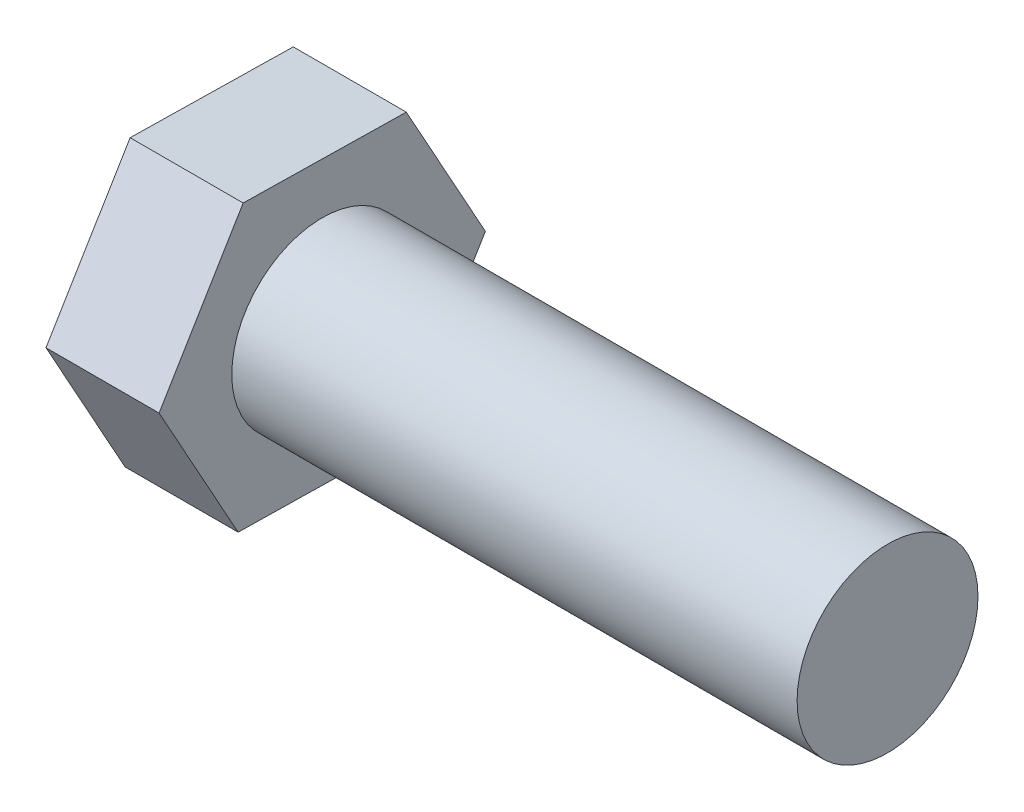
ISO-10303-21;
HEADER;
FILE_DESCRIPTION(('STEP AP214'),'2;1');
FILE_NAME('part.step','',(''),(''),'','','');
FILE_SCHEMA(('AUTOMOTIVE_DESIGN { 1 0 10303 214 1 1 1 1 }'));
ENDSEC;
DATA;
#1=APPLICATION_CONTEXT('core data for automotive mechanical design processes');
#2=APPLICATION_PROTOCOL_DEFINITION('international standard','automotive_design',2000,#1);
#3=PRODUCT_CONTEXT('',#1,'mechanical');
#4=PRODUCT('Part','Part','',(#3));
#5=PRODUCT_RELATED_PRODUCT_CATEGORY('part','',(#4));
#6=PRODUCT_DEFINITION_FORMATION('','',#4);
#7=PRODUCT_DEFINITION_CONTEXT('part definition',#1,'design');
#8=PRODUCT_DEFINITION('design','',#6,#7);
#9=PRODUCT_DEFINITION_SHAPE('','',#8);
#10=(LENGTH_UNIT() NAMED_UNIT(*) SI_UNIT(.MILLI.,.METRE.));
#11=(NAMED_UNIT(*) PLANE_ANGLE_UNIT() SI_UNIT($,.RADIAN.));
#12=(NAMED_UNIT(*) SI_UNIT($,.STERADIAN.) SOLID_ANGLE_UNIT());
#13=UNCERTAINTY_MEASURE_WITH_UNIT(LENGTH_MEASURE(1.E-05),#10,'distance_accuracy_value','');
#14=(GEOMETRIC_REPRESENTATION_CONTEXT(3) GLOBAL_UNCERTAINTY_ASSIGNED_CONTEXT((#13)) GLOBAL_UNIT_ASSIGNED_CONTEXT((#10,
#11,#12)) REPRESENTATION_CONTEXT('',''));
#15=CARTESIAN_POINT('',(0.,0.,0.));
#16=DIRECTION('',(0.,0.,1.));
#17=DIRECTION('',(1.,0.,0.));
#18=AXIS2_PLACEMENT_3D('',#15,#16,#17);
#19=CARTESIAN_POINT('',(-0.6,0.,0.));
#20=DIRECTION('',(-1.,0.,0.));
#21=DIRECTION('',(0.,0.,1.));
#22=AXIS2_PLACEMENT_3D('',#19,#20,#21);
#23=PLANE('',#22);
#24=DIRECTION('',(0.,0.856988725408425,-0.515335157468267));
#25=VECTOR('',#24,1.);
#26=CARTESIAN_POINT('',(-0.6,0.256906077015476,14.4314702161951));
#27=LINE('',#26,#25);
#28=CARTESIAN_POINT('',(-0.6,0.256906077015476,14.4314702161951));
#29=VERTEX_POINT('',#28);
#30=CARTESIAN_POINT('',(-0.6,12.6264728596912,6.99324791901554));
#31=VERTEX_POINT('',#30);
#32=EDGE_CURVE('E126',#29,#31,#27,.T.);
#33=ORIENTED_EDGE('',*,*,#32,.F.);
#34=DIRECTION('',(0.,0.874787700534985,0.484506428226409));
#35=VECTOR('',#34,1.);
#36=CARTESIAN_POINT('',(-0.6,-12.3695667826757,7.43822229717955));
#37=LINE('',#36,#35);
#38=CARTESIAN_POINT('',(-0.6,-12.3695667826757,7.43822229717955));
#39=VERTEX_POINT('',#38);
#40=EDGE_CURVE('E86',#39,#29,#37,.T.);
#41=ORIENTED_EDGE('',*,*,#40,.F.);
#42=DIRECTION('',(0.,0.0177989751265602,0.999841585694676));
#43=VECTOR('',#42,1.);
#44=CARTESIAN_POINT('',(-0.6,-12.6264728596912,-6.99324791901554));
#45=LINE('',#44,#43);
#46=CARTESIAN_POINT('',(-0.6,-12.6264728596912,-6.99324791901554));
#47=VERTEX_POINT('',#46);
#48=EDGE_CURVE('E80',#47,#39,#45,.T.);
#49=ORIENTED_EDGE('',*,*,#48,.F.);
#50=DIRECTION('',(0.,-0.856988725408425,0.515335157468266));
#51=VECTOR('',#50,1.);
#52=CARTESIAN_POINT('',(-0.6,-0.256906077015476,-14.4314702161951));
#53=LINE('',#52,#51);
#54=CARTESIAN_POINT('',(-0.6,-0.256906077015476,-14.4314702161951));
#55=VERTEX_POINT('',#54);
#56=EDGE_CURVE('E116',#55,#47,#53,.T.);
#57=ORIENTED_EDGE('',*,*,#56,.F.);
#58=DIRECTION('',(0.,-0.874787700534985,-0.484506428226409));
#59=VECTOR('',#58,1.);
#60=CARTESIAN_POINT('',(-0.6,12.3695667826757,-7.43822229717955));
#61=LINE('',#60,#59);
#62=CARTESIAN_POINT('',(-0.6,12.3695667826757,-7.43822229717955));
#63=VERTEX_POINT('',#62);
#64=EDGE_CURVE('E131',#63,#55,#61,.T.);
#65=ORIENTED_EDGE('',*,*,#64,.F.);
#66=DIRECTION('',(0.,-0.01779897512656,-0.999841585694676));
#67=VECTOR('',#66,1.);
#68=CARTESIAN_POINT('',(-0.6,12.6264728596912,6.99324791901554));
#69=LINE('',#68,#67);
#70=EDGE_CURVE('E129',#31,#63,#69,.T.);
#71=ORIENTED_EDGE('',*,*,#70,.F.);
#72=EDGE_LOOP('',(#33,#41,#49,#57,#65,#71));
#73=FACE_BOUND('',#72,.T.);
#74=CARTESIAN_POINT('',(-0.600000000000003,0.,0.));
#75=DIRECTION('',(-1.,0.,0.));
#76=DIRECTION('',(0.,0.,1.));
#77=AXIS2_PLACEMENT_3D('',#74,#75,#76);
#78=CIRCLE('',#77,8.);
#79=CARTESIAN_POINT('',(-0.600000000000003,0.,8.));
#80=VERTEX_POINT('',#79);
#81=EDGE_CURVE('E49',#80,#80,#78,.T.);
#82=ORIENTED_EDGE('',*,*,#81,.T.);
#83=EDGE_LOOP('',(#82));
#84=FACE_BOUND('',#83,.T.);
#85=ADVANCED_FACE('F40',(#73,#84),#23,.F.);
#86=CARTESIAN_POINT('',(-10.6,0.256906077015476,14.4314702161951));
#87=DIRECTION('',(0.,-0.515335157468267,-0.856988725408425));
#88=DIRECTION('',(0.,0.856988725408425,-0.515335157468267));
#89=AXIS2_PLACEMENT_3D('',#86,#87,#88);
#90=PLANE('',#89);
#91=ORIENTED_EDGE('',*,*,#32,.T.);
#92=DIRECTION('',(1.,0.,0.));
#93=VECTOR('',#92,1.);
#94=CARTESIAN_POINT('',(-10.6,12.6264728596912,6.99324791901554));
#95=LINE('',#94,#93);
#96=CARTESIAN_POINT('',(-10.6,12.6264728596912,6.99324791901554));
#97=VERTEX_POINT('',#96);
#98=EDGE_CURVE('E143',#97,#31,#95,.T.);
#99=ORIENTED_EDGE('',*,*,#98,.F.);
#100=DIRECTION('',(0.,0.856988725408425,-0.515335157468267));
#101=VECTOR('',#100,1.);
#102=CARTESIAN_POINT('',(-10.6,0.256906077015476,14.4314702161951));
#103=LINE('',#102,#101);
#104=CARTESIAN_POINT('',(-10.6,0.256906077015476,14.4314702161951));
#105=VERTEX_POINT('',#104);
#106=EDGE_CURVE('E136',#105,#97,#103,.T.);
#107=ORIENTED_EDGE('',*,*,#106,.F.);
#108=DIRECTION('',(1.,0.,0.));
#109=VECTOR('',#108,1.);
#110=CARTESIAN_POINT('',(-10.6,0.256906077015476,14.4314702161951));
#111=LINE('',#110,#109);
#112=EDGE_CURVE('E122',#105,#29,#111,.T.);
#113=ORIENTED_EDGE('',*,*,#112,.T.);
#114=EDGE_LOOP('',(#91,#99,#107,#113));
#115=FACE_BOUND('',#114,.T.);
#116=ADVANCED_FACE('F160',(#115),#90,.F.);
#117=CARTESIAN_POINT('',(-10.6,12.6264728596912,6.99324791901554));
#118=DIRECTION('',(0.,-0.999841585694676,0.01779897512656));
#119=DIRECTION('',(0.,-0.01779897512656,-0.999841585694676));
#120=AXIS2_PLACEMENT_3D('',#117,#118,#119);
#121=PLANE('',#120);
#122=ORIENTED_EDGE('',*,*,#70,.T.);
#123=DIRECTION('',(1.,0.,0.));
#124=VECTOR('',#123,1.);
#125=CARTESIAN_POINT('',(-10.6,12.3695667826757,-7.43822229717955));
#126=LINE('',#125,#124);
#127=CARTESIAN_POINT('',(-10.6,12.3695667826757,-7.43822229717955));
#128=VERTEX_POINT('',#127);
#129=EDGE_CURVE('E140',#128,#63,#126,.T.);
#130=ORIENTED_EDGE('',*,*,#129,.F.);
#131=DIRECTION('',(0.,-0.01779897512656,-0.999841585694676));
#132=VECTOR('',#131,1.);
#133=CARTESIAN_POINT('',(-10.6,12.6264728596912,6.99324791901554));
#134=LINE('',#133,#132);
#135=EDGE_CURVE('E95',#97,#128,#134,.T.);
#136=ORIENTED_EDGE('',*,*,#135,.F.);
#137=ORIENTED_EDGE('',*,*,#98,.T.);
#138=EDGE_LOOP('',(#122,#130,#136,#137));
#139=FACE_BOUND('',#138,.T.);
#140=ADVANCED_FACE('F166',(#139),#121,.F.);
#141=CARTESIAN_POINT('',(-10.6,12.3695667826757,-7.43822229717955));
#142=DIRECTION('',(0.,-0.484506428226409,0.874787700534986));
#143=DIRECTION('',(0.,-0.874787700534986,-0.484506428226409));
#144=AXIS2_PLACEMENT_3D('',#141,#142,#143);
#145=PLANE('',#144);
#146=ORIENTED_EDGE('',*,*,#64,.T.);
#147=DIRECTION('',(1.,0.,0.));
#148=VECTOR('',#147,1.);
#149=CARTESIAN_POINT('',(-10.6,-0.256906077015476,-14.4314702161951));
#150=LINE('',#149,#148);
#151=CARTESIAN_POINT('',(-10.6,-0.256906077015476,-14.4314702161951));
#152=VERTEX_POINT('',#151);
#153=EDGE_CURVE('E117',#152,#55,#150,.T.);
#154=ORIENTED_EDGE('',*,*,#153,.F.);
#155=DIRECTION('',(0.,-0.874787700534985,-0.484506428226409));
#156=VECTOR('',#155,1.);
#157=CARTESIAN_POINT('',(-10.6,12.3695667826757,-7.43822229717955));
#158=LINE('',#157,#156);
#159=EDGE_CURVE('E108',#128,#152,#158,.T.);
#160=ORIENTED_EDGE('',*,*,#159,.F.);
#161=ORIENTED_EDGE('',*,*,#129,.T.);
#162=EDGE_LOOP('',(#146,#154,#160,#161));
#163=FACE_BOUND('',#162,.T.);
#164=ADVANCED_FACE('F177',(#163),#145,.F.);
#165=CARTESIAN_POINT('',(-10.6,-0.256906077015476,-14.4314702161951));
#166=DIRECTION('',(0.,0.515335157468266,0.856988725408425));
#167=DIRECTION('',(0.,-0.856988725408425,0.515335157468266));
#168=AXIS2_PLACEMENT_3D('',#165,#166,#167);
#169=PLANE('',#168);
#170=ORIENTED_EDGE('',*,*,#56,.T.);
#171=DIRECTION('',(1.,0.,0.));
#172=VECTOR('',#171,1.);
#173=CARTESIAN_POINT('',(-10.6,-12.6264728596912,-6.99324791901554));
#174=LINE('',#173,#172);
#175=CARTESIAN_POINT('',(-10.6,-12.6264728596912,-6.99324791901554));
#176=VERTEX_POINT('',#175);
#177=EDGE_CURVE('E113',#176,#47,#174,.T.);
#178=ORIENTED_EDGE('',*,*,#177,.F.);
#179=DIRECTION('',(0.,-0.856988725408425,0.515335157468266));
#180=VECTOR('',#179,1.);
#181=CARTESIAN_POINT('',(-10.6,-0.256906077015476,-14.4314702161951));
#182=LINE('',#181,#180);
#183=EDGE_CURVE('E102',#152,#176,#182,.T.);
#184=ORIENTED_EDGE('',*,*,#183,.F.);
#185=ORIENTED_EDGE('',*,*,#153,.T.);
#186=EDGE_LOOP('',(#170,#178,#184,#185));
#187=FACE_BOUND('',#186,.T.);
#188=ADVANCED_FACE('F114',(#187),#169,.F.);
#189=CARTESIAN_POINT('',(-10.6,-12.6264728596912,-6.99324791901554));
#190=DIRECTION('',(0.,0.999841585694676,-0.0177989751265602));
#191=DIRECTION('',(0.,0.0177989751265602,0.999841585694676));
#192=AXIS2_PLACEMENT_3D('',#189,#190,#191);
#193=PLANE('',#192);
#194=ORIENTED_EDGE('',*,*,#48,.T.);
#195=DIRECTION('',(1.,0.,0.));
#196=VECTOR('',#195,1.);
#197=CARTESIAN_POINT('',(-10.6,-12.3695667826757,7.43822229717955));
#198=LINE('',#197,#196);
#199=CARTESIAN_POINT('',(-10.6,-12.3695667826757,7.43822229717955));
#200=VERTEX_POINT('',#199);
#201=EDGE_CURVE('E118',#200,#39,#198,.T.);
#202=ORIENTED_EDGE('',*,*,#201,.F.);
#203=DIRECTION('',(0.,0.0177989751265602,0.999841585694676));
#204=VECTOR('',#203,1.);
#205=CARTESIAN_POINT('',(-10.6,-12.6264728596912,-6.99324791901554));
#206=LINE('',#205,#204);
#207=EDGE_CURVE('E106',#176,#200,#206,.T.);
#208=ORIENTED_EDGE('',*,*,#207,.F.);
#209=ORIENTED_EDGE('',*,*,#177,.T.);
#210=EDGE_LOOP('',(#194,#202,#208,#209));
#211=FACE_BOUND('',#210,.T.);
#212=ADVANCED_FACE('F120',(#211),#193,.F.);
#213=CARTESIAN_POINT('',(-10.6,-12.3695667826757,7.43822229717955));
#214=DIRECTION('',(0.,0.48450642822641,-0.874787700534985));
#215=DIRECTION('',(0.,0.874787700534985,0.48450642822641));
#216=AXIS2_PLACEMENT_3D('',#213,#214,#215);
#217=PLANE('',#216);
#218=ORIENTED_EDGE('',*,*,#40,.T.);
#219=ORIENTED_EDGE('',*,*,#112,.F.);
#220=DIRECTION('',(0.,0.874787700534985,0.484506428226409));
#221=VECTOR('',#220,1.);
#222=CARTESIAN_POINT('',(-10.6,-12.3695667826757,7.43822229717955));
#223=LINE('',#222,#221);
#224=EDGE_CURVE('E57',#200,#105,#223,.T.);
#225=ORIENTED_EDGE('',*,*,#224,.F.);
#226=ORIENTED_EDGE('',*,*,#201,.T.);
#227=EDGE_LOOP('',(#218,#219,#225,#226));
#228=FACE_BOUND('',#227,.T.);
#229=ADVANCED_FACE('F156',(#228),#217,.F.);
#230=CARTESIAN_POINT('',(-10.6,0.,0.));
#231=DIRECTION('',(-1.,0.,0.));
#232=DIRECTION('',(0.,0.,1.));
#233=AXIS2_PLACEMENT_3D('',#230,#231,#232);
#234=PLANE('',#233);
#235=ORIENTED_EDGE('',*,*,#106,.T.);
#236=ORIENTED_EDGE('',*,*,#135,.T.);
#237=ORIENTED_EDGE('',*,*,#159,.T.);
#238=ORIENTED_EDGE('',*,*,#183,.T.);
#239=ORIENTED_EDGE('',*,*,#207,.T.);
#240=ORIENTED_EDGE('',*,*,#224,.T.);
#241=EDGE_LOOP('',(#235,#236,#237,#238,#239,#240));
#242=FACE_BOUND('',#241,.T.);
#243=ADVANCED_FACE('F104',(#242),#234,.T.);
#244=CARTESIAN_POINT('',(49.4,0.,0.));
#245=DIRECTION('',(-1.,0.,0.));
#246=DIRECTION('',(0.,0.,1.));
#247=AXIS2_PLACEMENT_3D('',#244,#245,#246);
#248=CYLINDRICAL_SURFACE('',#247,8.);
#249=CARTESIAN_POINT('',(49.4,0.,0.));
#250=DIRECTION('',(1.,0.,0.));
#251=DIRECTION('',(0.,0.,-1.));
#252=AXIS2_PLACEMENT_3D('',#249,#250,#251);
#253=CIRCLE('',#252,8.);
#254=CARTESIAN_POINT('',(49.4,0.,-8.));
#255=VERTEX_POINT('',#254);
#256=EDGE_CURVE('E11',#255,#255,#253,.T.);
#257=ORIENTED_EDGE('',*,*,#256,.F.);
#258=EDGE_LOOP('',(#257));
#259=FACE_BOUND('',#258,.T.);
#260=ORIENTED_EDGE('',*,*,#81,.F.);
#261=EDGE_LOOP('',(#260));
#262=FACE_BOUND('',#261,.T.);
#263=ADVANCED_FACE('F42',(#259,#262),#248,.T.);
#264=CARTESIAN_POINT('',(49.4,0.,0.));
#265=DIRECTION('',(1.,0.,0.));
#266=DIRECTION('',(0.,0.,-1.));
#267=AXIS2_PLACEMENT_3D('',#264,#265,#266);
#268=PLANE('',#267);
#269=ORIENTED_EDGE('',*,*,#256,.T.);
#270=EDGE_LOOP('',(#269));
#271=FACE_BOUND('',#270,.T.);
#272=ADVANCED_FACE('F149',(#271),#268,.T.);
#273=CLOSED_SHELL('',(#85,#116,#140,#164,#188,#212,#229,#243,#263,#272));
#274=MANIFOLD_SOLID_BREP('B2',#273);
#275=ADVANCED_BREP_SHAPE_REPRESENTATION('',(#18,#274),#14);
#276=SHAPE_DEFINITION_REPRESENTATION(#9,#275);
ENDSEC;
END-ISO-10303-21;
